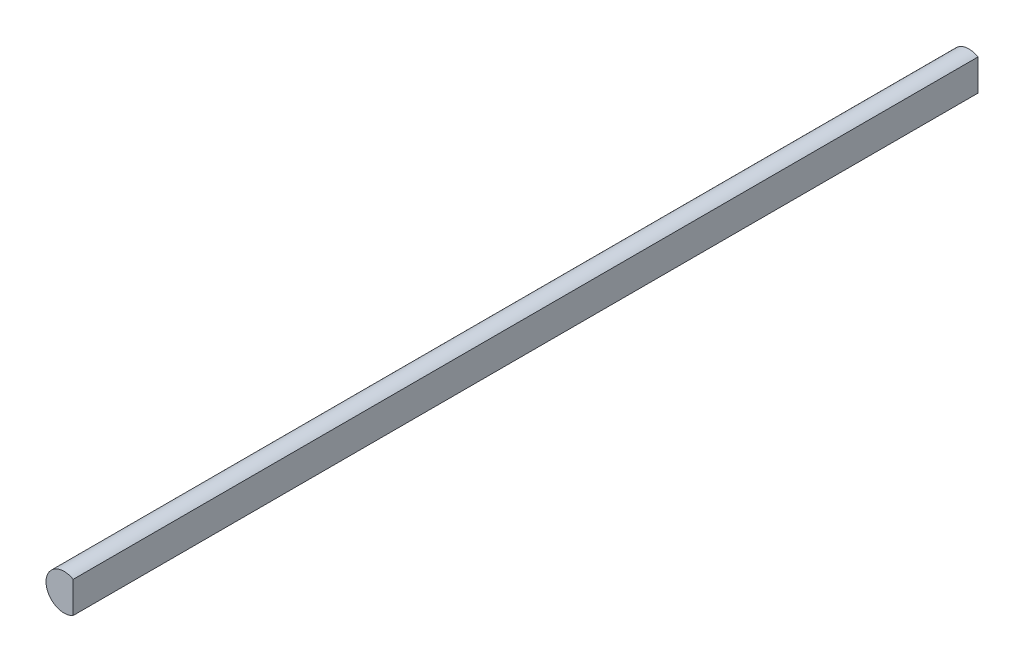
ISO-10303-21;
HEADER;
FILE_DESCRIPTION(('STEP AP214'),'2;1');
FILE_NAME('part.step','',(''),(''),'','','');
FILE_SCHEMA(('AUTOMOTIVE_DESIGN { 1 0 10303 214 1 1 1 1 }'));
ENDSEC;
DATA;
#1=APPLICATION_CONTEXT('core data for automotive mechanical design processes');
#2=APPLICATION_PROTOCOL_DEFINITION('international standard','automotive_design',2000,#1);
#3=PRODUCT_CONTEXT('',#1,'mechanical');
#4=PRODUCT('Part','Part','',(#3));
#5=PRODUCT_RELATED_PRODUCT_CATEGORY('part','',(#4));
#6=PRODUCT_DEFINITION_FORMATION('','',#4);
#7=PRODUCT_DEFINITION_CONTEXT('part definition',#1,'design');
#8=PRODUCT_DEFINITION('design','',#6,#7);
#9=PRODUCT_DEFINITION_SHAPE('','',#8);
#10=(LENGTH_UNIT() NAMED_UNIT(*) SI_UNIT(.MILLI.,.METRE.));
#11=(NAMED_UNIT(*) PLANE_ANGLE_UNIT() SI_UNIT($,.RADIAN.));
#12=(NAMED_UNIT(*) SI_UNIT($,.STERADIAN.) SOLID_ANGLE_UNIT());
#13=UNCERTAINTY_MEASURE_WITH_UNIT(LENGTH_MEASURE(1.E-05),#10,'distance_accuracy_value','');
#14=(GEOMETRIC_REPRESENTATION_CONTEXT(3) GLOBAL_UNCERTAINTY_ASSIGNED_CONTEXT((#13)) GLOBAL_UNIT_ASSIGNED_CONTEXT((#10,
#11,#12)) REPRESENTATION_CONTEXT('',''));
#15=CARTESIAN_POINT('',(0.,0.,0.));
#16=DIRECTION('',(0.,0.,1.));
#17=DIRECTION('',(1.,0.,0.));
#18=AXIS2_PLACEMENT_3D('',#15,#16,#17);
#19=CARTESIAN_POINT('',(0.,0.,50.));
#20=DIRECTION('',(0.,0.,-1.));
#21=DIRECTION('',(-1.,0.,0.));
#22=AXIS2_PLACEMENT_3D('',#19,#20,#21);
#23=CYLINDRICAL_SURFACE('',#22,2.);
#24=CARTESIAN_POINT('',(0.,0.,-50.));
#25=DIRECTION('',(0.,0.,1.));
#26=DIRECTION('',(1.,0.,0.));
#27=AXIS2_PLACEMENT_3D('',#24,#25,#26);
#28=CIRCLE('',#27,2.);
#29=CARTESIAN_POINT('',(1.,1.73205080756888,-50.));
#30=VERTEX_POINT('',#29);
#31=CARTESIAN_POINT('',(1.,-1.73205080756888,-50.));
#32=VERTEX_POINT('',#31);
#33=EDGE_CURVE('E66',#30,#32,#28,.T.);
#34=ORIENTED_EDGE('',*,*,#33,.T.);
#35=DIRECTION('',(0.,0.,-1.));
#36=VECTOR('',#35,1.);
#37=CARTESIAN_POINT('',(1.,-1.73205080756888,50.));
#38=LINE('',#37,#36);
#39=CARTESIAN_POINT('',(1.,-1.73205080756888,50.));
#40=VERTEX_POINT('',#39);
#41=EDGE_CURVE('E11',#40,#32,#38,.T.);
#42=ORIENTED_EDGE('',*,*,#41,.F.);
#43=CARTESIAN_POINT('',(0.,0.,50.));
#44=DIRECTION('',(0.,0.,1.));
#45=DIRECTION('',(1.,0.,0.));
#46=AXIS2_PLACEMENT_3D('',#43,#44,#45);
#47=CIRCLE('',#46,2.);
#48=CARTESIAN_POINT('',(1.,1.73205080756888,50.));
#49=VERTEX_POINT('',#48);
#50=EDGE_CURVE('E65',#49,#40,#47,.T.);
#51=ORIENTED_EDGE('',*,*,#50,.F.);
#52=DIRECTION('',(0.,0.,-1.));
#53=VECTOR('',#52,1.);
#54=CARTESIAN_POINT('',(1.,1.73205080756888,50.));
#55=LINE('',#54,#53);
#56=EDGE_CURVE('E43',#49,#30,#55,.T.);
#57=ORIENTED_EDGE('',*,*,#56,.T.);
#58=EDGE_LOOP('',(#34,#42,#51,#57));
#59=FACE_BOUND('',#58,.T.);
#60=ADVANCED_FACE('F35',(#59),#23,.T.);
#61=CARTESIAN_POINT('',(1.,1.73205080756888,50.));
#62=DIRECTION('',(-1.,0.,0.));
#63=DIRECTION('',(0.,0.,1.));
#64=AXIS2_PLACEMENT_3D('',#61,#62,#63);
#65=PLANE('',#64);
#66=DIRECTION('',(0.,1.,0.));
#67=VECTOR('',#66,1.);
#68=CARTESIAN_POINT('',(1.,1.73205080756888,-50.));
#69=LINE('',#68,#67);
#70=EDGE_CURVE('E58',#32,#30,#69,.T.);
#71=ORIENTED_EDGE('',*,*,#70,.T.);
#72=ORIENTED_EDGE('',*,*,#56,.F.);
#73=DIRECTION('',(0.,1.,0.));
#74=VECTOR('',#73,1.);
#75=CARTESIAN_POINT('',(1.,1.73205080756888,50.));
#76=LINE('',#75,#74);
#77=EDGE_CURVE('E50',#40,#49,#76,.T.);
#78=ORIENTED_EDGE('',*,*,#77,.F.);
#79=ORIENTED_EDGE('',*,*,#41,.T.);
#80=EDGE_LOOP('',(#71,#72,#78,#79));
#81=FACE_BOUND('',#80,.T.);
#82=ADVANCED_FACE('F61',(#81),#65,.F.);
#83=CARTESIAN_POINT('',(0.,0.,50.));
#84=DIRECTION('',(0.,0.,1.));
#85=DIRECTION('',(1.,0.,0.));
#86=AXIS2_PLACEMENT_3D('',#83,#84,#85);
#87=PLANE('',#86);
#88=ORIENTED_EDGE('',*,*,#50,.T.);
#89=ORIENTED_EDGE('',*,*,#77,.T.);
#90=EDGE_LOOP('',(#88,#89));
#91=FACE_BOUND('',#90,.T.);
#92=ADVANCED_FACE('F73',(#91),#87,.T.);
#93=CARTESIAN_POINT('',(0.,0.,-50.));
#94=DIRECTION('',(0.,0.,1.));
#95=DIRECTION('',(1.,0.,0.));
#96=AXIS2_PLACEMENT_3D('',#93,#94,#95);
#97=PLANE('',#96);
#98=ORIENTED_EDGE('',*,*,#33,.F.);
#99=ORIENTED_EDGE('',*,*,#70,.F.);
#100=EDGE_LOOP('',(#98,#99));
#101=FACE_BOUND('',#100,.T.);
#102=ADVANCED_FACE('F69',(#101),#97,.F.);
#103=CLOSED_SHELL('',(#60,#82,#92,#102));
#104=MANIFOLD_SOLID_BREP('B2',#103);
#105=ADVANCED_BREP_SHAPE_REPRESENTATION('',(#18,#104),#14);
#106=SHAPE_DEFINITION_REPRESENTATION(#9,#105);
ENDSEC;
END-ISO-10303-21;
